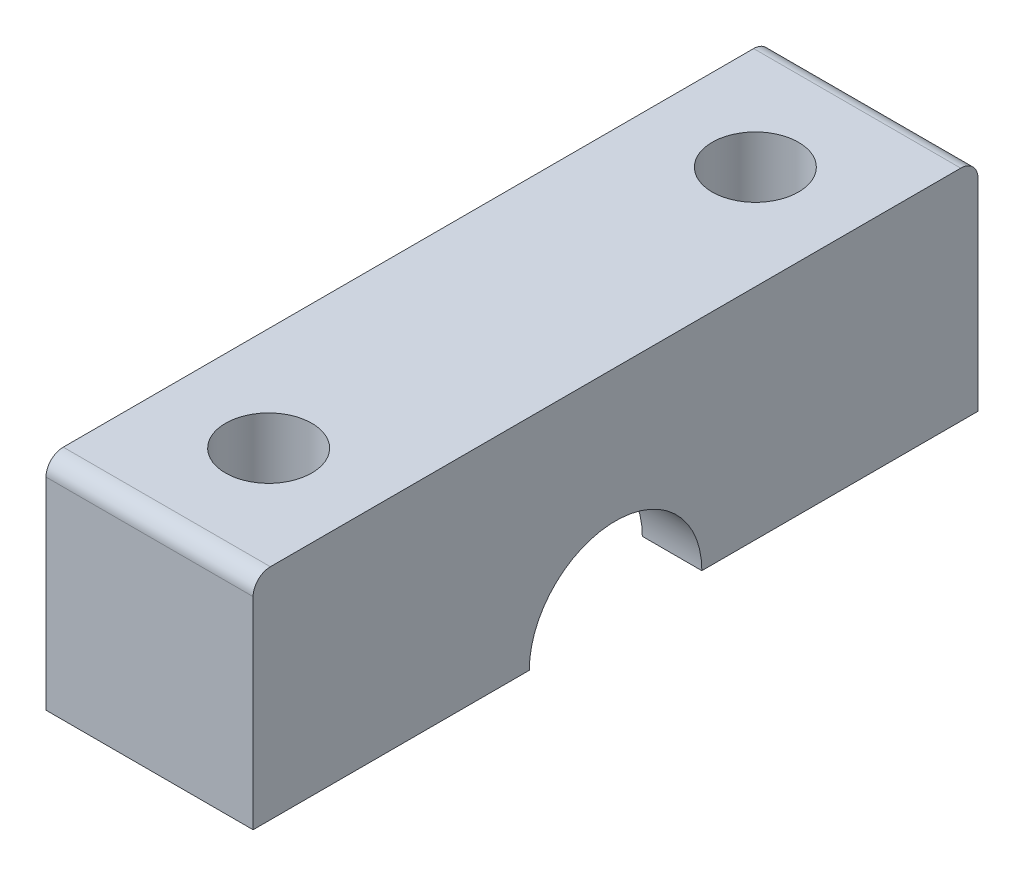
ISO-10303-21;
HEADER;
FILE_DESCRIPTION(('STEP AP214'),'2;1');
FILE_NAME('part.step','',(''),(''),'','','');
FILE_SCHEMA(('AUTOMOTIVE_DESIGN { 1 0 10303 214 1 1 1 1 }'));
ENDSEC;
DATA;
#1=APPLICATION_CONTEXT('core data for automotive mechanical design processes');
#2=APPLICATION_PROTOCOL_DEFINITION('international standard','automotive_design',2000,#1);
#3=PRODUCT_CONTEXT('',#1,'mechanical');
#4=PRODUCT('Part','Part','',(#3));
#5=PRODUCT_RELATED_PRODUCT_CATEGORY('part','',(#4));
#6=PRODUCT_DEFINITION_FORMATION('','',#4);
#7=PRODUCT_DEFINITION_CONTEXT('part definition',#1,'design');
#8=PRODUCT_DEFINITION('design','',#6,#7);
#9=PRODUCT_DEFINITION_SHAPE('','',#8);
#10=(LENGTH_UNIT() NAMED_UNIT(*) SI_UNIT(.MILLI.,.METRE.));
#11=(NAMED_UNIT(*) PLANE_ANGLE_UNIT() SI_UNIT($,.RADIAN.));
#12=(NAMED_UNIT(*) SI_UNIT($,.STERADIAN.) SOLID_ANGLE_UNIT());
#13=UNCERTAINTY_MEASURE_WITH_UNIT(LENGTH_MEASURE(1.E-05),#10,'distance_accuracy_value','');
#14=(GEOMETRIC_REPRESENTATION_CONTEXT(3) GLOBAL_UNCERTAINTY_ASSIGNED_CONTEXT((#13)) GLOBAL_UNIT_ASSIGNED_CONTEXT((#10,
#11,#12)) REPRESENTATION_CONTEXT('',''));
#15=CARTESIAN_POINT('',(0.,0.,0.));
#16=DIRECTION('',(0.,0.,1.));
#17=DIRECTION('',(1.,0.,0.));
#18=AXIS2_PLACEMENT_3D('',#15,#16,#17);
#19=CARTESIAN_POINT('',(44.1218733307813,23.,-16.));
#20=DIRECTION('',(0.,1.,0.));
#21=DIRECTION('',(0.,0.,1.));
#22=AXIS2_PLACEMENT_3D('',#19,#20,#21);
#23=PLANE('',#22);
#24=CARTESIAN_POINT('',(94.,23.,-6.9));
#25=DIRECTION('',(0.,1.,0.));
#26=DIRECTION('',(0.,0.,1.));
#27=AXIS2_PLACEMENT_3D('',#24,#25,#26);
#28=CIRCLE('',#27,2.49999999999999);
#29=CARTESIAN_POINT('',(94.,23.,-4.40000000000001));
#30=VERTEX_POINT('',#29);
#31=EDGE_CURVE('E288',#30,#30,#28,.F.);
#32=ORIENTED_EDGE('',*,*,#31,.F.);
#33=EDGE_LOOP('',(#32));
#34=FACE_BOUND('',#33,.T.);
#35=DIRECTION('',(0.,0.,-1.));
#36=VECTOR('',#35,1.);
#37=CARTESIAN_POINT('',(91.45,23.,-16.));
#38=LINE('',#37,#36);
#39=CARTESIAN_POINT('',(91.45,23.,-12.5));
#40=VERTEX_POINT('',#39);
#41=CARTESIAN_POINT('',(91.45,23.,-16.));
#42=VERTEX_POINT('',#41);
#43=EDGE_CURVE('E154',#40,#42,#38,.T.);
#44=ORIENTED_EDGE('',*,*,#43,.F.);
#45=DIRECTION('',(1.,0.,0.));
#46=VECTOR('',#45,1.);
#47=CARTESIAN_POINT('',(91.45,23.,-12.5));
#48=LINE('',#47,#46);
#49=CARTESIAN_POINT('',(96.55,23.,-12.5));
#50=VERTEX_POINT('',#49);
#51=EDGE_CURVE('E144',#40,#50,#48,.T.);
#52=ORIENTED_EDGE('',*,*,#51,.T.);
#53=DIRECTION('',(0.,0.,-1.));
#54=VECTOR('',#53,1.);
#55=CARTESIAN_POINT('',(96.55,23.,-16.));
#56=LINE('',#55,#54);
#57=CARTESIAN_POINT('',(96.55,23.,-16.));
#58=VERTEX_POINT('',#57);
#59=EDGE_CURVE('E129',#50,#58,#56,.T.);
#60=ORIENTED_EDGE('',*,*,#59,.T.);
#61=DIRECTION('',(1.,0.,0.));
#62=VECTOR('',#61,1.);
#63=CARTESIAN_POINT('',(44.1218733307813,23.,-16.));
#64=LINE('',#63,#62);
#65=CARTESIAN_POINT('',(100.,23.,-16.));
#66=VERTEX_POINT('',#65);
#67=EDGE_CURVE('E192',#58,#66,#64,.T.);
#68=ORIENTED_EDGE('',*,*,#67,.T.);
#69=DIRECTION('',(0.,0.,1.));
#70=VECTOR('',#69,1.);
#71=CARTESIAN_POINT('',(100.,23.,-16.));
#72=LINE('',#71,#70);
#73=CARTESIAN_POINT('',(100.,23.,0.));
#74=VERTEX_POINT('',#73);
#75=EDGE_CURVE('E185',#66,#74,#72,.T.);
#76=ORIENTED_EDGE('',*,*,#75,.T.);
#77=DIRECTION('',(1.,0.,0.));
#78=VECTOR('',#77,1.);
#79=CARTESIAN_POINT('',(44.1218733307813,23.,0.));
#80=LINE('',#79,#78);
#81=CARTESIAN_POINT('',(88.,23.,0.));
#82=VERTEX_POINT('',#81);
#83=EDGE_CURVE('E190',#82,#74,#80,.T.);
#84=ORIENTED_EDGE('',*,*,#83,.F.);
#85=DIRECTION('',(0.,0.,-1.));
#86=VECTOR('',#85,1.);
#87=CARTESIAN_POINT('',(88.,23.,-16.));
#88=LINE('',#87,#86);
#89=CARTESIAN_POINT('',(88.,23.,-16.));
#90=VERTEX_POINT('',#89);
#91=EDGE_CURVE('E163',#82,#90,#88,.T.);
#92=ORIENTED_EDGE('',*,*,#91,.T.);
#93=EDGE_CURVE('E193',#90,#42,#64,.T.);
#94=ORIENTED_EDGE('',*,*,#93,.T.);
#95=EDGE_LOOP('',(#44,#52,#60,#68,#76,#84,#92,#94));
#96=FACE_BOUND('',#95,.T.);
#97=ADVANCED_FACE('F39',(#34,#96),#23,.F.);
#98=CARTESIAN_POINT('',(44.1218733307813,23.,-21.));
#99=DIRECTION('',(1.,0.,0.));
#100=DIRECTION('',(0.,0.,-1.));
#101=AXIS2_PLACEMENT_3D('',#98,#99,#100);
#102=CYLINDRICAL_SURFACE('',#101,5.);
#103=CARTESIAN_POINT('',(91.45,23.,-21.));
#104=DIRECTION('',(1.,0.,0.));
#105=DIRECTION('',(0.,0.,-1.));
#106=AXIS2_PLACEMENT_3D('',#103,#104,#105);
#107=CIRCLE('',#106,5.);
#108=CARTESIAN_POINT('',(91.45,23.,-26.));
#109=VERTEX_POINT('',#108);
#110=EDGE_CURVE('E139',#42,#109,#107,.F.);
#111=ORIENTED_EDGE('',*,*,#110,.F.);
#112=ORIENTED_EDGE('',*,*,#93,.F.);
#113=CARTESIAN_POINT('',(88.,23.,-21.));
#114=DIRECTION('',(1.,0.,0.));
#115=DIRECTION('',(0.,0.,-1.));
#116=AXIS2_PLACEMENT_3D('',#113,#114,#115);
#117=CIRCLE('',#116,5.);
#118=CARTESIAN_POINT('',(88.,23.,-26.));
#119=VERTEX_POINT('',#118);
#120=EDGE_CURVE('E166',#90,#119,#117,.F.);
#121=ORIENTED_EDGE('',*,*,#120,.T.);
#122=DIRECTION('',(1.,0.,0.));
#123=VECTOR('',#122,1.);
#124=CARTESIAN_POINT('',(44.1218733307813,23.,-26.));
#125=LINE('',#124,#123);
#126=EDGE_CURVE('E196',#119,#109,#125,.T.);
#127=ORIENTED_EDGE('',*,*,#126,.T.);
#128=EDGE_LOOP('',(#111,#112,#121,#127));
#129=FACE_BOUND('',#128,.T.);
#130=ADVANCED_FACE('F254',(#129),#102,.F.);
#131=CARTESIAN_POINT('',(44.1218733307813,23.,-26.));
#132=DIRECTION('',(0.,-1.,0.));
#133=DIRECTION('',(0.,0.,-1.));
#134=AXIS2_PLACEMENT_3D('',#131,#132,#133);
#135=PLANE('',#134);
#136=CARTESIAN_POINT('',(94.,23.,-35.1));
#137=DIRECTION('',(0.,-1.,0.));
#138=DIRECTION('',(0.,0.,-1.));
#139=AXIS2_PLACEMENT_3D('',#136,#137,#138);
#140=CIRCLE('',#139,2.5);
#141=CARTESIAN_POINT('',(94.,23.,-37.6));
#142=VERTEX_POINT('',#141);
#143=EDGE_CURVE('E287',#142,#142,#140,.F.);
#144=ORIENTED_EDGE('',*,*,#143,.T.);
#145=EDGE_LOOP('',(#144));
#146=FACE_BOUND('',#145,.T.);
#147=DIRECTION('',(1.,0.,0.));
#148=VECTOR('',#147,1.);
#149=CARTESIAN_POINT('',(91.45,23.,-29.5));
#150=LINE('',#149,#148);
#151=CARTESIAN_POINT('',(91.45,23.,-29.5));
#152=VERTEX_POINT('',#151);
#153=CARTESIAN_POINT('',(96.55,23.,-29.5));
#154=VERTEX_POINT('',#153);
#155=EDGE_CURVE('E147',#152,#154,#150,.T.);
#156=ORIENTED_EDGE('',*,*,#155,.F.);
#157=DIRECTION('',(0.,0.,1.));
#158=VECTOR('',#157,1.);
#159=CARTESIAN_POINT('',(91.45,23.,-26.));
#160=LINE('',#159,#158);
#161=EDGE_CURVE('E205',#152,#109,#160,.T.);
#162=ORIENTED_EDGE('',*,*,#161,.T.);
#163=ORIENTED_EDGE('',*,*,#126,.F.);
#164=DIRECTION('',(0.,0.,1.));
#165=VECTOR('',#164,1.);
#166=CARTESIAN_POINT('',(88.,23.,-26.));
#167=LINE('',#166,#165);
#168=CARTESIAN_POINT('',(88.,23.,-42.));
#169=VERTEX_POINT('',#168);
#170=EDGE_CURVE('E170',#169,#119,#167,.T.);
#171=ORIENTED_EDGE('',*,*,#170,.F.);
#172=DIRECTION('',(1.,0.,0.));
#173=VECTOR('',#172,1.);
#174=CARTESIAN_POINT('',(44.1218733307813,23.,-42.));
#175=LINE('',#174,#173);
#176=CARTESIAN_POINT('',(100.,23.,-42.));
#177=VERTEX_POINT('',#176);
#178=EDGE_CURVE('E199',#169,#177,#175,.T.);
#179=ORIENTED_EDGE('',*,*,#178,.T.);
#180=DIRECTION('',(0.,0.,-1.));
#181=VECTOR('',#180,1.);
#182=CARTESIAN_POINT('',(100.,23.,-26.));
#183=LINE('',#182,#181);
#184=CARTESIAN_POINT('',(100.,23.,-26.));
#185=VERTEX_POINT('',#184);
#186=EDGE_CURVE('E179',#185,#177,#183,.T.);
#187=ORIENTED_EDGE('',*,*,#186,.F.);
#188=CARTESIAN_POINT('',(96.55,23.,-26.));
#189=VERTEX_POINT('',#188);
#190=EDGE_CURVE('E195',#189,#185,#125,.T.);
#191=ORIENTED_EDGE('',*,*,#190,.F.);
#192=DIRECTION('',(0.,0.,1.));
#193=VECTOR('',#192,1.);
#194=CARTESIAN_POINT('',(96.55,23.,-26.));
#195=LINE('',#194,#193);
#196=EDGE_CURVE('E176',#154,#189,#195,.T.);
#197=ORIENTED_EDGE('',*,*,#196,.F.);
#198=EDGE_LOOP('',(#156,#162,#163,#171,#179,#187,#191,#197));
#199=FACE_BOUND('',#198,.T.);
#200=ADVANCED_FACE('F240',(#146,#199),#135,.T.);
#201=CARTESIAN_POINT('',(100.,23.,-21.));
#202=DIRECTION('',(1.,0.,0.));
#203=DIRECTION('',(0.,0.,-1.));
#204=AXIS2_PLACEMENT_3D('',#201,#202,#203);
#205=PLANE('',#204);
#206=DIRECTION('',(0.,0.,-1.));
#207=VECTOR('',#206,1.);
#208=CARTESIAN_POINT('',(100.,35.7,0.));
#209=LINE('',#208,#207);
#210=CARTESIAN_POINT('',(100.,35.7,-1.));
#211=VERTEX_POINT('',#210);
#212=CARTESIAN_POINT('',(100.,35.7,-41.));
#213=VERTEX_POINT('',#212);
#214=EDGE_CURVE('E155',#211,#213,#209,.T.);
#215=ORIENTED_EDGE('',*,*,#214,.F.);
#216=CARTESIAN_POINT('',(100.,34.7,-1.));
#217=DIRECTION('',(1.,0.,0.));
#218=DIRECTION('',(0.,0.,-1.));
#219=AXIS2_PLACEMENT_3D('',#216,#217,#218);
#220=CIRCLE('',#219,1.);
#221=CARTESIAN_POINT('',(100.,34.7,0.));
#222=VERTEX_POINT('',#221);
#223=EDGE_CURVE('E215',#211,#222,#220,.T.);
#224=ORIENTED_EDGE('',*,*,#223,.T.);
#225=DIRECTION('',(0.,1.,0.));
#226=VECTOR('',#225,1.);
#227=CARTESIAN_POINT('',(100.,23.,0.));
#228=LINE('',#227,#226);
#229=EDGE_CURVE('E188',#74,#222,#228,.T.);
#230=ORIENTED_EDGE('',*,*,#229,.F.);
#231=ORIENTED_EDGE('',*,*,#75,.F.);
#232=CARTESIAN_POINT('',(100.,23.,-21.));
#233=DIRECTION('',(1.,0.,0.));
#234=DIRECTION('',(0.,0.,-1.));
#235=AXIS2_PLACEMENT_3D('',#232,#233,#234);
#236=CIRCLE('',#235,5.);
#237=EDGE_CURVE('E182',#185,#66,#236,.T.);
#238=ORIENTED_EDGE('',*,*,#237,.F.);
#239=ORIENTED_EDGE('',*,*,#186,.T.);
#240=DIRECTION('',(0.,-1.,0.));
#241=VECTOR('',#240,1.);
#242=CARTESIAN_POINT('',(100.,35.7,-42.));
#243=LINE('',#242,#241);
#244=CARTESIAN_POINT('',(100.,34.7,-42.));
#245=VERTEX_POINT('',#244);
#246=EDGE_CURVE('E158',#245,#177,#243,.T.);
#247=ORIENTED_EDGE('',*,*,#246,.F.);
#248=CARTESIAN_POINT('',(100.,34.7,-41.));
#249=DIRECTION('',(1.,0.,0.));
#250=DIRECTION('',(0.,0.,-1.));
#251=AXIS2_PLACEMENT_3D('',#248,#249,#250);
#252=CIRCLE('',#251,1.);
#253=EDGE_CURVE('E213',#245,#213,#252,.T.);
#254=ORIENTED_EDGE('',*,*,#253,.T.);
#255=EDGE_LOOP('',(#215,#224,#230,#231,#238,#239,#247,#254));
#256=FACE_BOUND('',#255,.T.);
#257=ADVANCED_FACE('F230',(#256),#205,.T.);
#258=CARTESIAN_POINT('',(44.1218733307813,23.,0.));
#259=DIRECTION('',(0.,0.,-1.));
#260=DIRECTION('',(0.,1.,0.));
#261=AXIS2_PLACEMENT_3D('',#258,#259,#260);
#262=PLANE('',#261);
#263=ORIENTED_EDGE('',*,*,#229,.T.);
#264=DIRECTION('',(1.,0.,0.));
#265=VECTOR('',#264,1.);
#266=CARTESIAN_POINT('',(44.1218733307813,34.7,0.));
#267=LINE('',#266,#265);
#268=CARTESIAN_POINT('',(88.,34.7,0.));
#269=VERTEX_POINT('',#268);
#270=EDGE_CURVE('E62',#222,#269,#267,.F.);
#271=ORIENTED_EDGE('',*,*,#270,.T.);
#272=DIRECTION('',(0.,-1.,0.));
#273=VECTOR('',#272,1.);
#274=CARTESIAN_POINT('',(88.,23.,0.));
#275=LINE('',#274,#273);
#276=EDGE_CURVE('E167',#269,#82,#275,.T.);
#277=ORIENTED_EDGE('',*,*,#276,.T.);
#278=ORIENTED_EDGE('',*,*,#83,.T.);
#279=EDGE_LOOP('',(#263,#271,#277,#278));
#280=FACE_BOUND('',#279,.T.);
#281=ADVANCED_FACE('F232',(#280),#262,.F.);
#282=ORIENTED_EDGE('',*,*,#67,.F.);
#283=CARTESIAN_POINT('',(96.55,23.,-21.));
#284=DIRECTION('',(1.,0.,0.));
#285=DIRECTION('',(0.,0.,-1.));
#286=AXIS2_PLACEMENT_3D('',#283,#284,#285);
#287=CIRCLE('',#286,5.);
#288=EDGE_CURVE('E135',#58,#189,#287,.F.);
#289=ORIENTED_EDGE('',*,*,#288,.T.);
#290=ORIENTED_EDGE('',*,*,#190,.T.);
#291=ORIENTED_EDGE('',*,*,#237,.T.);
#292=EDGE_LOOP('',(#282,#289,#290,#291));
#293=FACE_BOUND('',#292,.T.);
#294=ADVANCED_FACE('F264',(#293),#102,.F.);
#295=CARTESIAN_POINT('',(44.1218733307813,35.7,-42.));
#296=DIRECTION('',(0.,0.,1.));
#297=DIRECTION('',(0.,-1.,0.));
#298=AXIS2_PLACEMENT_3D('',#295,#296,#297);
#299=PLANE('',#298);
#300=DIRECTION('',(0.,1.,0.));
#301=VECTOR('',#300,1.);
#302=CARTESIAN_POINT('',(88.,35.7,-42.));
#303=LINE('',#302,#301);
#304=CARTESIAN_POINT('',(88.,34.7,-42.));
#305=VERTEX_POINT('',#304);
#306=EDGE_CURVE('E172',#169,#305,#303,.T.);
#307=ORIENTED_EDGE('',*,*,#306,.T.);
#308=DIRECTION('',(1.,0.,0.));
#309=VECTOR('',#308,1.);
#310=CARTESIAN_POINT('',(44.1218733307813,34.7,-42.));
#311=LINE('',#310,#309);
#312=EDGE_CURVE('E11',#305,#245,#311,.T.);
#313=ORIENTED_EDGE('',*,*,#312,.T.);
#314=ORIENTED_EDGE('',*,*,#246,.T.);
#315=ORIENTED_EDGE('',*,*,#178,.F.);
#316=EDGE_LOOP('',(#307,#313,#314,#315));
#317=FACE_BOUND('',#316,.T.);
#318=ADVANCED_FACE('F245',(#317),#299,.F.);
#319=CARTESIAN_POINT('',(44.1218733307813,35.7,0.));
#320=DIRECTION('',(0.,-1.,0.));
#321=DIRECTION('',(0.,0.,-1.));
#322=AXIS2_PLACEMENT_3D('',#319,#320,#321);
#323=PLANE('',#322);
#324=CARTESIAN_POINT('',(94.,35.7,-35.1));
#325=DIRECTION('',(0.,1.,0.));
#326=DIRECTION('',(0.,0.,1.));
#327=AXIS2_PLACEMENT_3D('',#324,#325,#326);
#328=CIRCLE('',#327,2.5);
#329=CARTESIAN_POINT('',(94.,35.7,-32.6));
#330=VERTEX_POINT('',#329);
#331=EDGE_CURVE('E150',#330,#330,#328,.T.);
#332=ORIENTED_EDGE('',*,*,#331,.F.);
#333=EDGE_LOOP('',(#332));
#334=FACE_BOUND('',#333,.T.);
#335=CARTESIAN_POINT('',(94.,35.7,-6.9));
#336=DIRECTION('',(0.,1.,0.));
#337=DIRECTION('',(0.,0.,1.));
#338=AXIS2_PLACEMENT_3D('',#335,#336,#337);
#339=CIRCLE('',#338,2.49999999999999);
#340=CARTESIAN_POINT('',(94.,35.7,-4.40000000000001));
#341=VERTEX_POINT('',#340);
#342=EDGE_CURVE('E285',#341,#341,#339,.T.);
#343=ORIENTED_EDGE('',*,*,#342,.F.);
#344=EDGE_LOOP('',(#343));
#345=FACE_BOUND('',#344,.T.);
#346=DIRECTION('',(0.,0.,1.));
#347=VECTOR('',#346,1.);
#348=CARTESIAN_POINT('',(88.,35.7,0.));
#349=LINE('',#348,#347);
#350=CARTESIAN_POINT('',(88.,35.7,-41.));
#351=VERTEX_POINT('',#350);
#352=CARTESIAN_POINT('',(88.,35.7,-1.));
#353=VERTEX_POINT('',#352);
#354=EDGE_CURVE('E174',#351,#353,#349,.T.);
#355=ORIENTED_EDGE('',*,*,#354,.T.);
#356=DIRECTION('',(1.,0.,0.));
#357=VECTOR('',#356,1.);
#358=CARTESIAN_POINT('',(44.1218733307813,35.7,-1.));
#359=LINE('',#358,#357);
#360=EDGE_CURVE('E210',#353,#211,#359,.T.);
#361=ORIENTED_EDGE('',*,*,#360,.T.);
#362=ORIENTED_EDGE('',*,*,#214,.T.);
#363=DIRECTION('',(1.,0.,0.));
#364=VECTOR('',#363,1.);
#365=CARTESIAN_POINT('',(44.1218733307813,35.7,-41.));
#366=LINE('',#365,#364);
#367=EDGE_CURVE('E208',#213,#351,#366,.F.);
#368=ORIENTED_EDGE('',*,*,#367,.T.);
#369=EDGE_LOOP('',(#355,#361,#362,#368));
#370=FACE_BOUND('',#369,.T.);
#371=ADVANCED_FACE('F224',(#334,#345,#370),#323,.F.);
#372=CARTESIAN_POINT('',(88.,23.,0.));
#373=DIRECTION('',(1.,0.,0.));
#374=DIRECTION('',(0.,0.,-1.));
#375=AXIS2_PLACEMENT_3D('',#372,#373,#374);
#376=PLANE('',#375);
#377=ORIENTED_EDGE('',*,*,#276,.F.);
#378=CARTESIAN_POINT('',(88.,34.7,-1.));
#379=DIRECTION('',(1.,0.,0.));
#380=DIRECTION('',(0.,0.,-1.));
#381=AXIS2_PLACEMENT_3D('',#378,#379,#380);
#382=CIRCLE('',#381,1.);
#383=EDGE_CURVE('E47',#269,#353,#382,.F.);
#384=ORIENTED_EDGE('',*,*,#383,.T.);
#385=ORIENTED_EDGE('',*,*,#354,.F.);
#386=CARTESIAN_POINT('',(88.,34.7,-41.));
#387=DIRECTION('',(1.,0.,0.));
#388=DIRECTION('',(0.,0.,-1.));
#389=AXIS2_PLACEMENT_3D('',#386,#387,#388);
#390=CIRCLE('',#389,1.);
#391=EDGE_CURVE('E54',#351,#305,#390,.F.);
#392=ORIENTED_EDGE('',*,*,#391,.T.);
#393=ORIENTED_EDGE('',*,*,#306,.F.);
#394=ORIENTED_EDGE('',*,*,#170,.T.);
#395=ORIENTED_EDGE('',*,*,#120,.F.);
#396=ORIENTED_EDGE('',*,*,#91,.F.);
#397=EDGE_LOOP('',(#377,#384,#385,#392,#393,#394,#395,#396));
#398=FACE_BOUND('',#397,.T.);
#399=ADVANCED_FACE('F219',(#398),#376,.F.);
#400=CARTESIAN_POINT('',(91.45,23.,-21.));
#401=DIRECTION('',(1.,0.,0.));
#402=DIRECTION('',(0.,0.,-1.));
#403=AXIS2_PLACEMENT_3D('',#400,#401,#402);
#404=CYLINDRICAL_SURFACE('',#403,8.50000000000001);
#405=CARTESIAN_POINT('',(91.45,23.,-21.));
#406=DIRECTION('',(1.,0.,0.));
#407=DIRECTION('',(0.,0.,-1.));
#408=AXIS2_PLACEMENT_3D('',#405,#406,#407);
#409=CIRCLE('',#408,8.50000000000001);
#410=EDGE_CURVE('E149',#152,#40,#409,.T.);
#411=ORIENTED_EDGE('',*,*,#410,.F.);
#412=ORIENTED_EDGE('',*,*,#155,.T.);
#413=CARTESIAN_POINT('',(96.55,23.,-21.));
#414=DIRECTION('',(1.,0.,0.));
#415=DIRECTION('',(0.,0.,-1.));
#416=AXIS2_PLACEMENT_3D('',#413,#414,#415);
#417=CIRCLE('',#416,8.50000000000001);
#418=EDGE_CURVE('E132',#154,#50,#417,.T.);
#419=ORIENTED_EDGE('',*,*,#418,.T.);
#420=ORIENTED_EDGE('',*,*,#51,.F.);
#421=EDGE_LOOP('',(#411,#412,#419,#420));
#422=FACE_BOUND('',#421,.T.);
#423=ADVANCED_FACE('F143',(#422),#404,.F.);
#424=CARTESIAN_POINT('',(91.45,23.,-21.));
#425=DIRECTION('',(1.,0.,0.));
#426=DIRECTION('',(0.,0.,-1.));
#427=AXIS2_PLACEMENT_3D('',#424,#425,#426);
#428=PLANE('',#427);
#429=ORIENTED_EDGE('',*,*,#43,.T.);
#430=ORIENTED_EDGE('',*,*,#110,.T.);
#431=ORIENTED_EDGE('',*,*,#161,.F.);
#432=ORIENTED_EDGE('',*,*,#410,.T.);
#433=EDGE_LOOP('',(#429,#430,#431,#432));
#434=FACE_BOUND('',#433,.T.);
#435=ADVANCED_FACE('F298',(#434),#428,.T.);
#436=CARTESIAN_POINT('',(96.55,23.,-21.));
#437=DIRECTION('',(1.,0.,0.));
#438=DIRECTION('',(0.,0.,-1.));
#439=AXIS2_PLACEMENT_3D('',#436,#437,#438);
#440=PLANE('',#439);
#441=ORIENTED_EDGE('',*,*,#418,.F.);
#442=ORIENTED_EDGE('',*,*,#196,.T.);
#443=ORIENTED_EDGE('',*,*,#288,.F.);
#444=ORIENTED_EDGE('',*,*,#59,.F.);
#445=EDGE_LOOP('',(#441,#442,#443,#444));
#446=FACE_BOUND('',#445,.T.);
#447=ADVANCED_FACE('F131',(#446),#440,.F.);
#448=CARTESIAN_POINT('',(94.,22.999,-6.9));
#449=DIRECTION('',(0.,1.,0.));
#450=DIRECTION('',(0.,0.,1.));
#451=AXIS2_PLACEMENT_3D('',#448,#449,#450);
#452=CYLINDRICAL_SURFACE('',#451,2.49999999999999);
#453=ORIENTED_EDGE('',*,*,#342,.T.);
#454=EDGE_LOOP('',(#453));
#455=FACE_BOUND('',#454,.T.);
#456=ORIENTED_EDGE('',*,*,#31,.T.);
#457=EDGE_LOOP('',(#456));
#458=FACE_BOUND('',#457,.T.);
#459=ADVANCED_FACE('F305',(#455,#458),#452,.F.);
#460=CARTESIAN_POINT('',(94.,22.999,-35.1));
#461=DIRECTION('',(0.,1.,0.));
#462=DIRECTION('',(0.,0.,1.));
#463=AXIS2_PLACEMENT_3D('',#460,#461,#462);
#464=CYLINDRICAL_SURFACE('',#463,2.5);
#465=ORIENTED_EDGE('',*,*,#143,.F.);
#466=EDGE_LOOP('',(#465));
#467=FACE_BOUND('',#466,.T.);
#468=ORIENTED_EDGE('',*,*,#331,.T.);
#469=EDGE_LOOP('',(#468));
#470=FACE_BOUND('',#469,.T.);
#471=ADVANCED_FACE('F252',(#467,#470),#464,.F.);
#472=CARTESIAN_POINT('',(44.1218733307813,34.7,-1.));
#473=DIRECTION('',(1.,0.,0.));
#474=DIRECTION('',(0.,0.,-1.));
#475=AXIS2_PLACEMENT_3D('',#472,#473,#474);
#476=CYLINDRICAL_SURFACE('',#475,1.);
#477=ORIENTED_EDGE('',*,*,#383,.F.);
#478=ORIENTED_EDGE('',*,*,#270,.F.);
#479=ORIENTED_EDGE('',*,*,#223,.F.);
#480=ORIENTED_EDGE('',*,*,#360,.F.);
#481=EDGE_LOOP('',(#477,#478,#479,#480));
#482=FACE_BOUND('',#481,.T.);
#483=ADVANCED_FACE('F227',(#482),#476,.T.);
#484=CARTESIAN_POINT('',(44.1218733307813,34.7,-41.));
#485=DIRECTION('',(1.,0.,0.));
#486=DIRECTION('',(0.,0.,-1.));
#487=AXIS2_PLACEMENT_3D('',#484,#485,#486);
#488=CYLINDRICAL_SURFACE('',#487,1.);
#489=ORIENTED_EDGE('',*,*,#391,.F.);
#490=ORIENTED_EDGE('',*,*,#367,.F.);
#491=ORIENTED_EDGE('',*,*,#253,.F.);
#492=ORIENTED_EDGE('',*,*,#312,.F.);
#493=EDGE_LOOP('',(#489,#490,#491,#492));
#494=FACE_BOUND('',#493,.T.);
#495=ADVANCED_FACE('F41',(#494),#488,.T.);
#496=CLOSED_SHELL('',(#97,#130,#200,#257,#281,#294,#318,#371,#399,#423,#435,#447,#459,#471,#483,#495));
#497=MANIFOLD_SOLID_BREP('B2',#496);
#498=ADVANCED_BREP_SHAPE_REPRESENTATION('',(#18,#497),#14);
#499=SHAPE_DEFINITION_REPRESENTATION(#9,#498);
ENDSEC;
END-ISO-10303-21;
